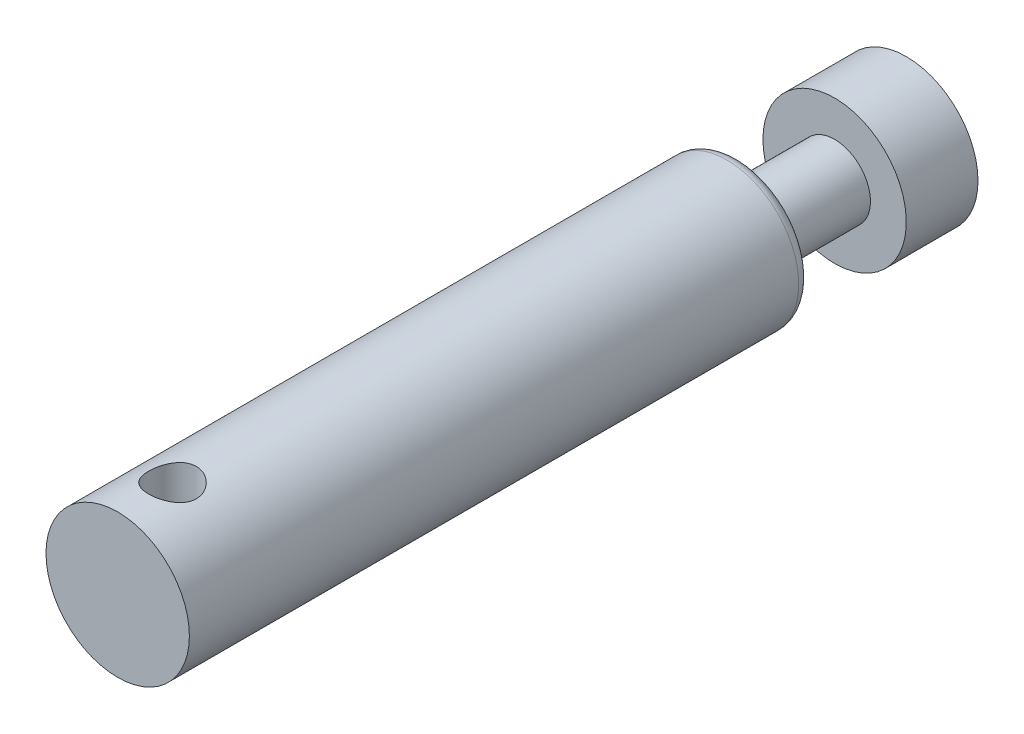
ISO-10303-21;
HEADER;
FILE_DESCRIPTION(('STEP AP214'),'2;1');
FILE_NAME('part.step','',(''),(''),'','','');
FILE_SCHEMA(('AUTOMOTIVE_DESIGN { 1 0 10303 214 1 1 1 1 }'));
ENDSEC;
DATA;
#1=APPLICATION_CONTEXT('core data for automotive mechanical design processes');
#2=APPLICATION_PROTOCOL_DEFINITION('international standard','automotive_design',2000,#1);
#3=PRODUCT_CONTEXT('',#1,'mechanical');
#4=PRODUCT('Part','Part','',(#3));
#5=PRODUCT_RELATED_PRODUCT_CATEGORY('part','',(#4));
#6=PRODUCT_DEFINITION_FORMATION('','',#4);
#7=PRODUCT_DEFINITION_CONTEXT('part definition',#1,'design');
#8=PRODUCT_DEFINITION('design','',#6,#7);
#9=PRODUCT_DEFINITION_SHAPE('','',#8);
#10=(LENGTH_UNIT() NAMED_UNIT(*) SI_UNIT(.MILLI.,.METRE.));
#11=(NAMED_UNIT(*) PLANE_ANGLE_UNIT() SI_UNIT($,.RADIAN.));
#12=(NAMED_UNIT(*) SI_UNIT($,.STERADIAN.) SOLID_ANGLE_UNIT());
#13=UNCERTAINTY_MEASURE_WITH_UNIT(LENGTH_MEASURE(1.E-05),#10,'distance_accuracy_value','');
#14=(GEOMETRIC_REPRESENTATION_CONTEXT(3) GLOBAL_UNCERTAINTY_ASSIGNED_CONTEXT((#13)) GLOBAL_UNIT_ASSIGNED_CONTEXT((#10,
#11,#12)) REPRESENTATION_CONTEXT('',''));
#15=CARTESIAN_POINT('',(0.,0.,0.));
#16=DIRECTION('',(0.,0.,1.));
#17=DIRECTION('',(1.,0.,0.));
#18=AXIS2_PLACEMENT_3D('',#15,#16,#17);
#19=CARTESIAN_POINT('',(0.,0.,33.));
#20=DIRECTION('',(0.,0.,-1.));
#21=DIRECTION('',(-1.,0.,0.));
#22=AXIS2_PLACEMENT_3D('',#19,#20,#21);
#23=CYLINDRICAL_SURFACE('',#22,3.);
#24=CARTESIAN_POINT('',(0.,0.,0.));
#25=DIRECTION('',(0.,0.,1.));
#26=DIRECTION('',(1.,0.,0.));
#27=AXIS2_PLACEMENT_3D('',#24,#25,#26);
#28=CIRCLE('',#27,3.);
#29=CARTESIAN_POINT('',(3.,0.,0.));
#30=VERTEX_POINT('',#29);
#31=EDGE_CURVE('E98',#30,#30,#28,.T.);
#32=ORIENTED_EDGE('',*,*,#31,.T.);
#33=EDGE_LOOP('',(#32));
#34=FACE_BOUND('',#33,.T.);
#35=CARTESIAN_POINT('',(0.,0.,3.));
#36=DIRECTION('',(0.,0.,-1.));
#37=DIRECTION('',(-1.,0.,0.));
#38=AXIS2_PLACEMENT_3D('',#35,#36,#37);
#39=CIRCLE('',#38,3.);
#40=CARTESIAN_POINT('',(-3.,0.,3.));
#41=VERTEX_POINT('',#40);
#42=EDGE_CURVE('E101',#41,#41,#39,.T.);
#43=ORIENTED_EDGE('',*,*,#42,.T.);
#44=EDGE_LOOP('',(#43));
#45=FACE_BOUND('',#44,.T.);
#46=ADVANCED_FACE('F37',(#34,#45),#23,.T.);
#47=CARTESIAN_POINT('',(0.,0.,0.));
#48=DIRECTION('',(0.,0.,1.));
#49=DIRECTION('',(1.,0.,0.));
#50=AXIS2_PLACEMENT_3D('',#47,#48,#49);
#51=PLANE('',#50);
#52=ORIENTED_EDGE('',*,*,#31,.F.);
#53=EDGE_LOOP('',(#52));
#54=FACE_BOUND('',#53,.T.);
#55=ADVANCED_FACE('F85',(#54),#51,.F.);
#56=CARTESIAN_POINT('',(3.,0.,3.));
#57=DIRECTION('',(0.,0.,1.));
#58=DIRECTION('',(1.,0.,0.));
#59=AXIS2_PLACEMENT_3D('',#56,#57,#58);
#60=PLANE('',#59);
#61=CARTESIAN_POINT('',(0.,0.,3.));
#62=DIRECTION('',(0.,0.,-1.));
#63=DIRECTION('',(-1.,0.,0.));
#64=AXIS2_PLACEMENT_3D('',#61,#62,#63);
#65=CIRCLE('',#64,1.5);
#66=CARTESIAN_POINT('',(-1.5,0.,3.));
#67=VERTEX_POINT('',#66);
#68=EDGE_CURVE('E108',#67,#67,#65,.T.);
#69=ORIENTED_EDGE('',*,*,#68,.T.);
#70=EDGE_LOOP('',(#69));
#71=FACE_BOUND('',#70,.T.);
#72=ORIENTED_EDGE('',*,*,#42,.F.);
#73=EDGE_LOOP('',(#72));
#74=FACE_BOUND('',#73,.T.);
#75=ADVANCED_FACE('F81',(#71,#74),#60,.T.);
#76=CARTESIAN_POINT('',(0.,0.,0.));
#77=DIRECTION('',(0.,0.,-1.));
#78=DIRECTION('',(-1.,0.,0.));
#79=AXIS2_PLACEMENT_3D('',#76,#77,#78);
#80=CYLINDRICAL_SURFACE('',#79,1.5);
#81=CARTESIAN_POINT('',(0.,0.,7.));
#82=DIRECTION('',(0.,0.,-1.));
#83=DIRECTION('',(-1.,0.,0.));
#84=AXIS2_PLACEMENT_3D('',#81,#82,#83);
#85=CIRCLE('',#84,1.5);
#86=CARTESIAN_POINT('',(-1.5,0.,7.));
#87=VERTEX_POINT('',#86);
#88=EDGE_CURVE('E176',#87,#87,#85,.T.);
#89=ORIENTED_EDGE('',*,*,#88,.T.);
#90=EDGE_LOOP('',(#89));
#91=FACE_BOUND('',#90,.T.);
#92=ORIENTED_EDGE('',*,*,#68,.F.);
#93=EDGE_LOOP('',(#92));
#94=FACE_BOUND('',#93,.T.);
#95=ADVANCED_FACE('F77',(#91,#94),#80,.T.);
#96=CARTESIAN_POINT('',(1.5,0.,7.));
#97=DIRECTION('',(0.,0.,-1.));
#98=DIRECTION('',(-1.,0.,0.));
#99=AXIS2_PLACEMENT_3D('',#96,#97,#98);
#100=PLANE('',#99);
#101=CARTESIAN_POINT('',(0.,0.,7.));
#102=DIRECTION('',(0.,0.,-1.));
#103=DIRECTION('',(-1.,0.,0.));
#104=AXIS2_PLACEMENT_3D('',#101,#102,#103);
#105=CIRCLE('',#104,2.5);
#106=CARTESIAN_POINT('',(-2.5,0.,7.));
#107=VERTEX_POINT('',#106);
#108=EDGE_CURVE('E59',#107,#107,#105,.T.);
#109=ORIENTED_EDGE('',*,*,#108,.T.);
#110=EDGE_LOOP('',(#109));
#111=FACE_BOUND('',#110,.T.);
#112=ORIENTED_EDGE('',*,*,#88,.F.);
#113=EDGE_LOOP('',(#112));
#114=FACE_BOUND('',#113,.T.);
#115=ADVANCED_FACE('F72',(#111,#114),#100,.T.);
#116=CARTESIAN_POINT('',(0.,0.,33.));
#117=DIRECTION('',(0.,0.,1.));
#118=DIRECTION('',(1.,0.,0.));
#119=AXIS2_PLACEMENT_3D('',#116,#117,#118);
#120=PLANE('',#119);
#121=CARTESIAN_POINT('',(0.,0.,33.));
#122=DIRECTION('',(0.,0.,1.));
#123=DIRECTION('',(1.,0.,0.));
#124=AXIS2_PLACEMENT_3D('',#121,#122,#123);
#125=CIRCLE('',#124,3.);
#126=CARTESIAN_POINT('',(3.,0.,33.));
#127=VERTEX_POINT('',#126);
#128=EDGE_CURVE('E100',#127,#127,#125,.T.);
#129=ORIENTED_EDGE('',*,*,#128,.T.);
#130=EDGE_LOOP('',(#129));
#131=FACE_BOUND('',#130,.T.);
#132=ADVANCED_FACE('F76',(#131),#120,.T.);
#133=CARTESIAN_POINT('',(0.,-3.,31.7066480152121));
#134=CARTESIAN_POINT('',(0.0545633628867228,-3.00000015300943,31.7066482689438));
#135=CARTESIAN_POINT('',(0.109125194538549,-2.99849769507545,31.7021677490849));
#136=CARTESIAN_POINT('',(0.216641760872971,-2.99265210203281,31.6844189063949));
#137=CARTESIAN_POINT('',(0.269596328118817,-2.98830867202152,31.6711496712632));
#138=CARTESIAN_POINT('',(0.372332789501775,-2.97725307906442,31.6363287718281));
#139=CARTESIAN_POINT('',(0.422119825886031,-2.97054487730853,31.6147909527528));
#140=CARTESIAN_POINT('',(0.517374936805321,-2.95544445717342,31.5641068423738));
#141=CARTESIAN_POINT('',(0.562842156958703,-2.94705190667778,31.5349590502095));
#142=CARTESIAN_POINT('',(0.649741675022265,-2.92914094443005,31.4688222103534));
#143=CARTESIAN_POINT('',(0.691003700298309,-2.91959556463785,31.4316167809516));
#144=CARTESIAN_POINT('',(0.766832692702083,-2.90060314783121,31.3508808605055));
#145=CARTESIAN_POINT('',(0.801398185489461,-2.89115613290549,31.3073489802836));
#146=CARTESIAN_POINT('',(0.863824942227858,-2.87313332477274,31.2136629000157));
#147=CARTESIAN_POINT('',(0.891464858221031,-2.86459039275688,31.16335427548));
#148=CARTESIAN_POINT('',(0.937818873877722,-2.84975305418601,31.0584719207536));
#149=CARTESIAN_POINT('',(0.956535697386765,-2.84345796160745,31.0038994980494));
#150=CARTESIAN_POINT('',(0.983873461509163,-2.83411303269377,30.8939747937154));
#151=CARTESIAN_POINT('',(0.992813448271769,-2.83096095769611,30.838710806723));
#152=CARTESIAN_POINT('',(1.00134112333448,-2.82795656629507,30.7273842610562));
#153=CARTESIAN_POINT('',(1.00093170160472,-2.8281032302273,30.6713219545029));
#154=CARTESIAN_POINT('',(0.99101990370342,-2.8315901500818,30.5627113847681));
#155=CARTESIAN_POINT('',(0.981933913166995,-2.83478415867533,30.5101196122931));
#156=CARTESIAN_POINT('',(0.955606162849418,-2.84376657724551,30.4072545956053));
#157=CARTESIAN_POINT('',(0.938363426591872,-2.84955529784107,30.356981629777));
#158=CARTESIAN_POINT('',(0.895939058060212,-2.86317911131249,30.2592352656206));
#159=CARTESIAN_POINT('',(0.870634048707263,-2.87104565793117,30.2118199897426));
#160=CARTESIAN_POINT('',(0.81288910630314,-2.88792558575726,30.1217771069324));
#161=CARTESIAN_POINT('',(0.780447112364006,-2.89693929790463,30.0791508882787));
#162=CARTESIAN_POINT('',(0.707349332682238,-2.91567329167741,29.9975564170513));
#163=CARTESIAN_POINT('',(0.666353150076313,-2.92540589354843,29.958895320703));
#164=CARTESIAN_POINT('',(0.578339569970066,-2.94406938387037,29.8889167485487));
#165=CARTESIAN_POINT('',(0.531321595660816,-2.95300019538067,29.8575999770476));
#166=CARTESIAN_POINT('',(0.43194761304627,-2.96917107937794,29.802951714977));
#167=CARTESIAN_POINT('',(0.37954327641634,-2.97639350008039,29.7797025238714));
#168=CARTESIAN_POINT('',(0.271269083364511,-2.98820567144434,29.7424448412564));
#169=CARTESIAN_POINT('',(0.215400438154957,-2.99279633654878,29.7284331397887));
#170=CARTESIAN_POINT('',(0.104383829529307,-2.99867627071441,29.7105923491898));
#171=CARTESIAN_POINT('',(0.0493095998648481,-3.00010001833731,29.7063482060394));
#172=CARTESIAN_POINT('',(-0.060775069960234,-2.99988902694825,29.7069806888106));
#173=CARTESIAN_POINT('',(-0.115785519319645,-2.99825480419352,29.711855775192));
#174=CARTESIAN_POINT('',(-0.222519866304257,-2.99220024717114,29.7302599229481));
#175=CARTESIAN_POINT('',(-0.274292806834854,-2.98786198711228,29.7435342212616));
#176=CARTESIAN_POINT('',(-0.37485595857956,-2.97691846830034,29.7780414596788));
#177=CARTESIAN_POINT('',(-0.423645788508558,-2.97031292046541,29.7992754146798));
#178=CARTESIAN_POINT('',(-0.518288296393321,-2.95528931287427,29.849718447053));
#179=CARTESIAN_POINT('',(-0.564029959217328,-2.94682814756305,29.8791226084957));
#180=CARTESIAN_POINT('',(-0.650064830135402,-2.92905253915743,29.9448421652252));
#181=CARTESIAN_POINT('',(-0.690356367794892,-2.91973783591888,29.9811596712423));
#182=CARTESIAN_POINT('',(-0.766252507807012,-2.90076847982472,30.0616267662204));
#183=CARTESIAN_POINT('',(-0.80156096924849,-2.89111761095155,30.1060572421454));
#184=CARTESIAN_POINT('',(-0.864257522320853,-2.87299973286981,30.2004195830166));
#185=CARTESIAN_POINT('',(-0.891645547920843,-2.8645327335312,30.2503514938223));
#186=CARTESIAN_POINT('',(-0.93759693042336,-2.84982391820308,30.3543210305187));
#187=CARTESIAN_POINT('',(-0.956178132197765,-2.84357760900632,30.4083500944549));
#188=CARTESIAN_POINT('',(-0.983894666792162,-2.83410832399133,30.5190266653363));
#189=CARTESIAN_POINT('',(-0.993034254961243,-2.83088398622698,30.5756729806452));
#190=CARTESIAN_POINT('',(-1.00127628247038,-2.82797858875071,30.6868451112253));
#191=CARTESIAN_POINT('',(-1.00087025731093,-2.82812400344299,30.7413303554638));
#192=CARTESIAN_POINT('',(-0.991242293454878,-2.8315126992356,30.8494130901119));
#193=CARTESIAN_POINT('',(-0.982020879458887,-2.83475579595884,30.903010633165));
#194=CARTESIAN_POINT('',(-0.955371813126981,-2.84384524278943,31.0067836782248));
#195=CARTESIAN_POINT('',(-0.938103346014881,-2.84964098015514,31.0570048402193));
#196=CARTESIAN_POINT('',(-0.895979365760384,-2.86316398825433,31.1538754221476));
#197=CARTESIAN_POINT('',(-0.871122168553982,-2.87089168765296,31.2005240463994));
#198=CARTESIAN_POINT('',(-0.813260692583252,-2.8878282922406,31.2911316851358));
#199=CARTESIAN_POINT('',(-0.779948242764535,-2.89708711641604,31.3348845171107));
#200=CARTESIAN_POINT('',(-0.706642883135701,-2.91583356283786,31.4163378285961));
#201=CARTESIAN_POINT('',(-0.666648084451499,-2.92532124912517,31.4540365909001));
#202=CARTESIAN_POINT('',(-0.57924155692068,-2.94390030525393,31.5237924275013));
#203=CARTESIAN_POINT('',(-0.53160151349973,-2.95296181801216,31.5555723629631));
#204=CARTESIAN_POINT('',(-0.431357357406633,-2.96925991172652,31.6106384440627));
#205=CARTESIAN_POINT('',(-0.378754518132352,-2.9764969590794,31.6339267611341));
#206=CARTESIAN_POINT('',(-0.272493647200976,-2.98805515068532,31.6703696477008));
#207=CARTESIAN_POINT('',(-0.218987757676409,-2.9924921242252,31.6839304814755));
#208=CARTESIAN_POINT('',(-0.110320416010247,-2.99846407064224,31.7020682958892));
#209=CARTESIAN_POINT('',(-0.0551594255687465,-2.99999984531906,31.7066477587086));
#210=CARTESIAN_POINT('',(0.,-3.,31.7066480152121));
#211=B_SPLINE_CURVE_WITH_KNOTS('',3,(#133,#134,#135,#136,#137,#138,#139,#140,#141,#142,#143,
#144,#145,#146,#147,#148,#149,#150,#151,#152,#153,#154,#155,#156,#157,#158,#159,#160,#161,#162,
#163,#164,#165,#166,#167,#168,#169,#170,#171,#172,#173,#174,#175,#176,#177,#178,#179,#180,#181,
#182,#183,#184,#185,#186,#187,#188,#189,#190,#191,#192,#193,#194,#195,#196,#197,#198,#199,#200,
#201,#202,#203,#204,#205,#206,#207,#208,#209,#210),.UNSPECIFIED.,.T.,.F.,(4,2,2,2,2,2,2,2,2,2,2,
2,2,2,2,2,2,2,2,2,2,2,2,2,2,2,2,2,2,2,2,2,2,2,2,2,2,2,4),(0.,0.16348710602601,0.326991185267519,
0.490222672870269,0.653486377799097,0.821846842827558,0.9902443328753,1.1634838482347,
1.33667044692833,1.5040192574184,1.67131633987485,1.8309682655128,1.99063930855482,
2.15288171155131,2.31517102558207,2.48593305811367,2.65671145966618,2.82918405650357,
3.00159668877208,3.16653583175169,3.33144713164176,3.49158157978214,3.65173645284104,
3.81610399843736,3.98052180821891,4.15241022880752,4.32430008234997,4.49584013824416,
4.66730284700845,4.82995666056619,4.99260079341185,5.15215587070227,5.31174638165787,
5.47830066681615,5.64490211113589,5.8179966082491,5.99104681142266,6.15636558363624,
6.3216386602795),.UNSPECIFIED.);
#212=CARTESIAN_POINT('',(0.,-3.,31.7066480152121));
#213=VERTEX_POINT('',#212);
#214=EDGE_CURVE('E10',#213,#213,#211,.T.);
#215=ORIENTED_EDGE('',*,*,#214,.T.);
#216=EDGE_LOOP('',(#215));
#217=FACE_BOUND('',#216,.T.);
#218=CARTESIAN_POINT('',(0.,3.,31.7066480152121));
#219=CARTESIAN_POINT('',(-0.0545633628867228,3.00000015300943,31.7066482689438));
#220=CARTESIAN_POINT('',(-0.109125194538549,2.99849769507545,31.7021677490849));
#221=CARTESIAN_POINT('',(-0.216641760872971,2.99265210203281,31.6844189063949));
#222=CARTESIAN_POINT('',(-0.269596328118817,2.98830867202152,31.6711496712632));
#223=CARTESIAN_POINT('',(-0.372332789501775,2.97725307906442,31.6363287718281));
#224=CARTESIAN_POINT('',(-0.422119825886031,2.97054487730853,31.6147909527528));
#225=CARTESIAN_POINT('',(-0.517374936805321,2.95544445717342,31.5641068423738));
#226=CARTESIAN_POINT('',(-0.562842156958703,2.94705190667778,31.5349590502095));
#227=CARTESIAN_POINT('',(-0.649741675022265,2.92914094443005,31.4688222103534));
#228=CARTESIAN_POINT('',(-0.691003700298309,2.91959556463785,31.4316167809516));
#229=CARTESIAN_POINT('',(-0.766832692702083,2.90060314783121,31.3508808605055));
#230=CARTESIAN_POINT('',(-0.801398185489461,2.89115613290549,31.3073489802836));
#231=CARTESIAN_POINT('',(-0.863824942227858,2.87313332477274,31.2136629000157));
#232=CARTESIAN_POINT('',(-0.891464858221031,2.86459039275688,31.16335427548));
#233=CARTESIAN_POINT('',(-0.937818873877722,2.84975305418601,31.0584719207536));
#234=CARTESIAN_POINT('',(-0.956535697386765,2.84345796160745,31.0038994980494));
#235=CARTESIAN_POINT('',(-0.983873461509163,2.83411303269377,30.8939747937154));
#236=CARTESIAN_POINT('',(-0.992813448271769,2.83096095769611,30.838710806723));
#237=CARTESIAN_POINT('',(-1.00134112333448,2.82795656629507,30.7273842610562));
#238=CARTESIAN_POINT('',(-1.00093170160472,2.8281032302273,30.6713219545029));
#239=CARTESIAN_POINT('',(-0.99101990370342,2.8315901500818,30.5627113847681));
#240=CARTESIAN_POINT('',(-0.981933913166995,2.83478415867533,30.5101196122931));
#241=CARTESIAN_POINT('',(-0.955606162849418,2.84376657724551,30.4072545956053));
#242=CARTESIAN_POINT('',(-0.938363426591872,2.84955529784107,30.356981629777));
#243=CARTESIAN_POINT('',(-0.895939058060212,2.86317911131249,30.2592352656206));
#244=CARTESIAN_POINT('',(-0.870634048707263,2.87104565793117,30.2118199897426));
#245=CARTESIAN_POINT('',(-0.81288910630314,2.88792558575726,30.1217771069324));
#246=CARTESIAN_POINT('',(-0.780447112364006,2.89693929790463,30.0791508882787));
#247=CARTESIAN_POINT('',(-0.707349332682238,2.91567329167741,29.9975564170513));
#248=CARTESIAN_POINT('',(-0.666353150076313,2.92540589354843,29.958895320703));
#249=CARTESIAN_POINT('',(-0.578339569970066,2.94406938387037,29.8889167485487));
#250=CARTESIAN_POINT('',(-0.531321595660816,2.95300019538067,29.8575999770476));
#251=CARTESIAN_POINT('',(-0.43194761304627,2.96917107937794,29.802951714977));
#252=CARTESIAN_POINT('',(-0.37954327641634,2.97639350008039,29.7797025238714));
#253=CARTESIAN_POINT('',(-0.271269083364511,2.98820567144434,29.7424448412564));
#254=CARTESIAN_POINT('',(-0.215400438154957,2.99279633654878,29.7284331397887));
#255=CARTESIAN_POINT('',(-0.104383829529307,2.99867627071441,29.7105923491898));
#256=CARTESIAN_POINT('',(-0.0493095998648481,3.00010001833731,29.7063482060394));
#257=CARTESIAN_POINT('',(0.060775069960234,2.99988902694825,29.7069806888106));
#258=CARTESIAN_POINT('',(0.115785519319645,2.99825480419352,29.711855775192));
#259=CARTESIAN_POINT('',(0.222519866304257,2.99220024717114,29.7302599229481));
#260=CARTESIAN_POINT('',(0.274292806834854,2.98786198711228,29.7435342212616));
#261=CARTESIAN_POINT('',(0.37485595857956,2.97691846830034,29.7780414596788));
#262=CARTESIAN_POINT('',(0.423645788508558,2.97031292046541,29.7992754146798));
#263=CARTESIAN_POINT('',(0.518288296393321,2.95528931287427,29.849718447053));
#264=CARTESIAN_POINT('',(0.564029959217328,2.94682814756305,29.8791226084957));
#265=CARTESIAN_POINT('',(0.650064830135402,2.92905253915743,29.9448421652252));
#266=CARTESIAN_POINT('',(0.690356367794892,2.91973783591888,29.9811596712423));
#267=CARTESIAN_POINT('',(0.766252507807012,2.90076847982472,30.0616267662204));
#268=CARTESIAN_POINT('',(0.80156096924849,2.89111761095155,30.1060572421454));
#269=CARTESIAN_POINT('',(0.864257522320853,2.87299973286981,30.2004195830166));
#270=CARTESIAN_POINT('',(0.891645547920843,2.8645327335312,30.2503514938223));
#271=CARTESIAN_POINT('',(0.93759693042336,2.84982391820308,30.3543210305187));
#272=CARTESIAN_POINT('',(0.956178132197765,2.84357760900632,30.4083500944549));
#273=CARTESIAN_POINT('',(0.983894666792162,2.83410832399133,30.5190266653363));
#274=CARTESIAN_POINT('',(0.993034254961243,2.83088398622698,30.5756729806452));
#275=CARTESIAN_POINT('',(1.00127628247038,2.82797858875071,30.6868451112253));
#276=CARTESIAN_POINT('',(1.00087025731093,2.82812400344299,30.7413303554638));
#277=CARTESIAN_POINT('',(0.991242293454878,2.8315126992356,30.8494130901119));
#278=CARTESIAN_POINT('',(0.982020879458887,2.83475579595884,30.903010633165));
#279=CARTESIAN_POINT('',(0.955371813126981,2.84384524278943,31.0067836782248));
#280=CARTESIAN_POINT('',(0.938103346014881,2.84964098015514,31.0570048402193));
#281=CARTESIAN_POINT('',(0.895979365760384,2.86316398825433,31.1538754221476));
#282=CARTESIAN_POINT('',(0.871122168553982,2.87089168765296,31.2005240463994));
#283=CARTESIAN_POINT('',(0.813260692583252,2.8878282922406,31.2911316851358));
#284=CARTESIAN_POINT('',(0.779948242764535,2.89708711641604,31.3348845171107));
#285=CARTESIAN_POINT('',(0.706642883135701,2.91583356283786,31.4163378285961));
#286=CARTESIAN_POINT('',(0.666648084451499,2.92532124912517,31.4540365909001));
#287=CARTESIAN_POINT('',(0.57924155692068,2.94390030525393,31.5237924275013));
#288=CARTESIAN_POINT('',(0.53160151349973,2.95296181801216,31.5555723629631));
#289=CARTESIAN_POINT('',(0.431357357406633,2.96925991172652,31.6106384440627));
#290=CARTESIAN_POINT('',(0.378754518132352,2.9764969590794,31.6339267611341));
#291=CARTESIAN_POINT('',(0.272493647200976,2.98805515068532,31.6703696477008));
#292=CARTESIAN_POINT('',(0.218987757676409,2.9924921242252,31.6839304814755));
#293=CARTESIAN_POINT('',(0.110320416010247,2.99846407064224,31.7020682958892));
#294=CARTESIAN_POINT('',(0.0551594255687465,2.99999984531906,31.7066477587086));
#295=CARTESIAN_POINT('',(0.,3.,31.7066480152121));
#296=B_SPLINE_CURVE_WITH_KNOTS('',3,(#218,#219,#220,#221,#222,#223,#224,#225,#226,#227,#228,
#229,#230,#231,#232,#233,#234,#235,#236,#237,#238,#239,#240,#241,#242,#243,#244,#245,#246,#247,
#248,#249,#250,#251,#252,#253,#254,#255,#256,#257,#258,#259,#260,#261,#262,#263,#264,#265,#266,
#267,#268,#269,#270,#271,#272,#273,#274,#275,#276,#277,#278,#279,#280,#281,#282,#283,#284,#285,
#286,#287,#288,#289,#290,#291,#292,#293,#294,#295),.UNSPECIFIED.,.T.,.F.,(4,2,2,2,2,2,2,2,2,2,2,
2,2,2,2,2,2,2,2,2,2,2,2,2,2,2,2,2,2,2,2,2,2,2,2,2,2,2,4),(0.,0.16348710602601,0.326991185267519,
0.490222672870269,0.653486377799097,0.821846842827558,0.9902443328753,1.1634838482347,
1.33667044692833,1.5040192574184,1.67131633987485,1.8309682655128,1.99063930855482,
2.15288171155131,2.31517102558207,2.48593305811367,2.65671145966618,2.82918405650357,
3.00159668877208,3.16653583175169,3.33144713164176,3.49158157978214,3.65173645284104,
3.81610399843736,3.98052180821891,4.15241022880752,4.32430008234997,4.49584013824416,
4.66730284700845,4.82995666056619,4.99260079341185,5.15215587070227,5.31174638165787,
5.47830066681615,5.64490211113589,5.8179966082491,5.99104681142266,6.15636558363624,
6.3216386602795),.UNSPECIFIED.);
#297=CARTESIAN_POINT('',(0.,3.,31.7066480152121));
#298=VERTEX_POINT('',#297);
#299=EDGE_CURVE('E49',#298,#298,#296,.T.);
#300=ORIENTED_EDGE('',*,*,#299,.T.);
#301=EDGE_LOOP('',(#300));
#302=FACE_BOUND('',#301,.T.);
#303=CARTESIAN_POINT('',(0.,0.,7.5));
#304=DIRECTION('',(0.,0.,-1.));
#305=DIRECTION('',(-1.,0.,0.));
#306=AXIS2_PLACEMENT_3D('',#303,#304,#305);
#307=CIRCLE('',#306,3.);
#308=CARTESIAN_POINT('',(-3.,0.,7.5));
#309=VERTEX_POINT('',#308);
#310=EDGE_CURVE('E54',#309,#309,#307,.F.);
#311=ORIENTED_EDGE('',*,*,#310,.T.);
#312=EDGE_LOOP('',(#311));
#313=FACE_BOUND('',#312,.T.);
#314=ORIENTED_EDGE('',*,*,#128,.F.);
#315=EDGE_LOOP('',(#314));
#316=FACE_BOUND('',#315,.T.);
#317=ADVANCED_FACE('F88',(#217,#302,#313,#316),#23,.T.);
#318=CARTESIAN_POINT('',(0.,0.,7.5));
#319=DIRECTION('',(0.,0.,-1.));
#320=DIRECTION('',(-1.,0.,0.));
#321=AXIS2_PLACEMENT_3D('',#318,#319,#320);
#322=TOROIDAL_SURFACE('',#321,2.5,0.5);
#323=ORIENTED_EDGE('',*,*,#310,.F.);
#324=EDGE_LOOP('',(#323));
#325=FACE_BOUND('',#324,.T.);
#326=ORIENTED_EDGE('',*,*,#108,.F.);
#327=EDGE_LOOP('',(#326));
#328=FACE_BOUND('',#327,.T.);
#329=ADVANCED_FACE('F39',(#325,#328),#322,.T.);
#330=CARTESIAN_POINT('',(0.,-3.,30.7066480152121));
#331=DIRECTION('',(0.,1.,0.));
#332=DIRECTION('',(0.,0.,1.));
#333=AXIS2_PLACEMENT_3D('',#330,#331,#332);
#334=CYLINDRICAL_SURFACE('',#333,1.);
#335=ORIENTED_EDGE('',*,*,#299,.F.);
#336=EDGE_LOOP('',(#335));
#337=FACE_BOUND('',#336,.T.);
#338=ORIENTED_EDGE('',*,*,#214,.F.);
#339=EDGE_LOOP('',(#338));
#340=FACE_BOUND('',#339,.T.);
#341=ADVANCED_FACE('F67',(#337,#340),#334,.F.);
#342=CLOSED_SHELL('',(#46,#55,#75,#95,#115,#132,#317,#329,#341));
#343=MANIFOLD_SOLID_BREP('B2',#342);
#344=ADVANCED_BREP_SHAPE_REPRESENTATION('',(#18,#343),#14);
#345=SHAPE_DEFINITION_REPRESENTATION(#9,#344);
ENDSEC;
END-ISO-10303-21;
